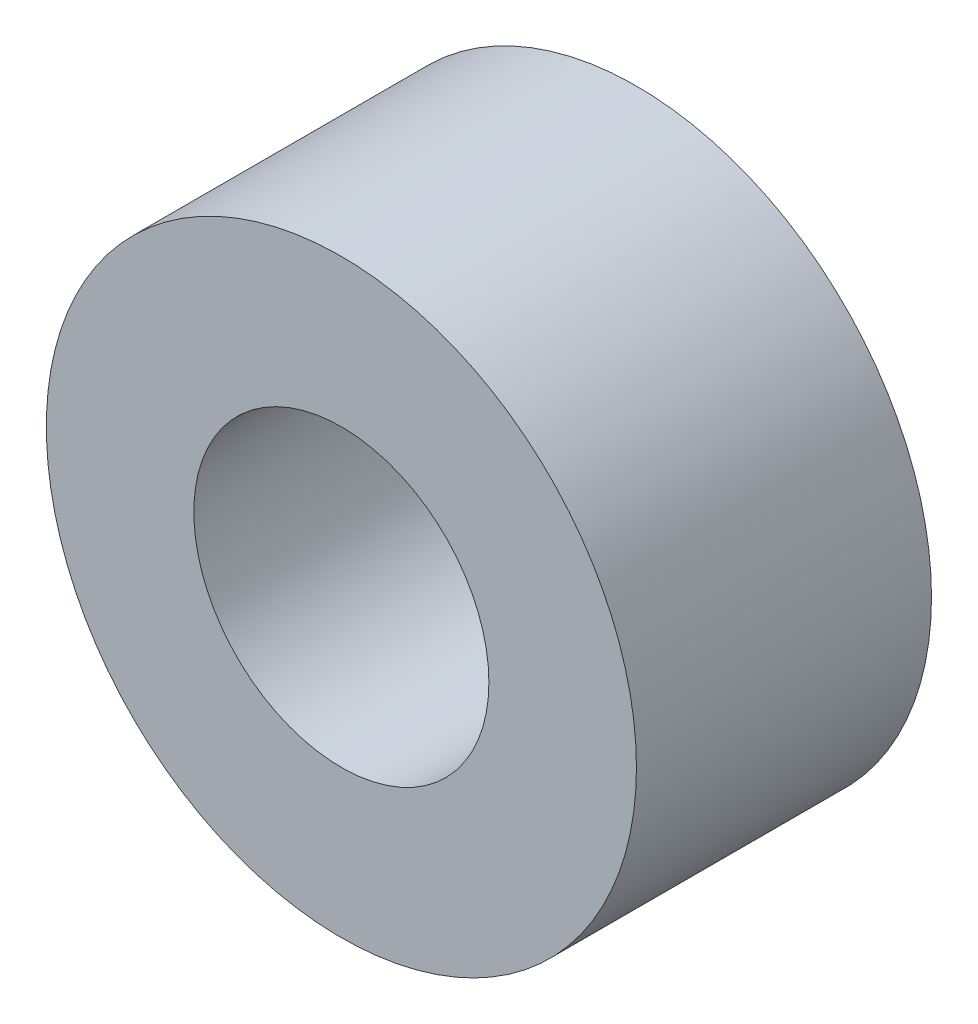
ISO-10303-21;
HEADER;
FILE_DESCRIPTION(('STEP AP214'),'2;1');
FILE_NAME('part.step','',(''),(''),'','','');
FILE_SCHEMA(('AUTOMOTIVE_DESIGN { 1 0 10303 214 1 1 1 1 }'));
ENDSEC;
DATA;
#1=APPLICATION_CONTEXT('core data for automotive mechanical design processes');
#2=APPLICATION_PROTOCOL_DEFINITION('international standard','automotive_design',2000,#1);
#3=PRODUCT_CONTEXT('',#1,'mechanical');
#4=PRODUCT('Part','Part','',(#3));
#5=PRODUCT_RELATED_PRODUCT_CATEGORY('part','',(#4));
#6=PRODUCT_DEFINITION_FORMATION('','',#4);
#7=PRODUCT_DEFINITION_CONTEXT('part definition',#1,'design');
#8=PRODUCT_DEFINITION('design','',#6,#7);
#9=PRODUCT_DEFINITION_SHAPE('','',#8);
#10=(LENGTH_UNIT() NAMED_UNIT(*) SI_UNIT(.MILLI.,.METRE.));
#11=(NAMED_UNIT(*) PLANE_ANGLE_UNIT() SI_UNIT($,.RADIAN.));
#12=(NAMED_UNIT(*) SI_UNIT($,.STERADIAN.) SOLID_ANGLE_UNIT());
#13=UNCERTAINTY_MEASURE_WITH_UNIT(LENGTH_MEASURE(1.E-05),#10,'distance_accuracy_value','');
#14=(GEOMETRIC_REPRESENTATION_CONTEXT(3) GLOBAL_UNCERTAINTY_ASSIGNED_CONTEXT((#13)) GLOBAL_UNIT_ASSIGNED_CONTEXT((#10,
#11,#12)) REPRESENTATION_CONTEXT('',''));
#15=CARTESIAN_POINT('',(0.,0.,0.));
#16=DIRECTION('',(0.,0.,1.));
#17=DIRECTION('',(1.,0.,0.));
#18=AXIS2_PLACEMENT_3D('',#15,#16,#17);
#19=CARTESIAN_POINT('',(0.,0.,3.175));
#20=DIRECTION('',(0.,0.,1.));
#21=DIRECTION('',(1.,0.,0.));
#22=AXIS2_PLACEMENT_3D('',#19,#20,#21);
#23=PLANE('',#22);
#24=CARTESIAN_POINT('',(0.,0.,3.175));
#25=DIRECTION('',(0.,0.,1.));
#26=DIRECTION('',(1.,0.,0.));
#27=AXIS2_PLACEMENT_3D('',#24,#25,#26);
#28=CIRCLE('',#27,3.175);
#29=CARTESIAN_POINT('',(3.175,0.,3.175));
#30=VERTEX_POINT('',#29);
#31=EDGE_CURVE('E10',#30,#30,#28,.T.);
#32=ORIENTED_EDGE('',*,*,#31,.T.);
#33=EDGE_LOOP('',(#32));
#34=FACE_BOUND('',#33,.T.);
#35=CARTESIAN_POINT('',(0.,0.,3.175));
#36=DIRECTION('',(0.,0.,1.));
#37=DIRECTION('',(1.,0.,0.));
#38=AXIS2_PLACEMENT_3D('',#35,#36,#37);
#39=CIRCLE('',#38,1.5875);
#40=CARTESIAN_POINT('',(1.5875,0.,3.175));
#41=VERTEX_POINT('',#40);
#42=EDGE_CURVE('E53',#41,#41,#39,.T.);
#43=ORIENTED_EDGE('',*,*,#42,.F.);
#44=EDGE_LOOP('',(#43));
#45=FACE_BOUND('',#44,.T.);
#46=ADVANCED_FACE('F40',(#34,#45),#23,.T.);
#47=CARTESIAN_POINT('',(0.,0.,0.));
#48=DIRECTION('',(0.,0.,1.));
#49=DIRECTION('',(1.,0.,0.));
#50=AXIS2_PLACEMENT_3D('',#47,#48,#49);
#51=PLANE('',#50);
#52=CARTESIAN_POINT('',(0.,0.,0.));
#53=DIRECTION('',(0.,0.,1.));
#54=DIRECTION('',(1.,0.,0.));
#55=AXIS2_PLACEMENT_3D('',#52,#53,#54);
#56=CIRCLE('',#55,3.175);
#57=CARTESIAN_POINT('',(3.175,0.,0.));
#58=VERTEX_POINT('',#57);
#59=EDGE_CURVE('E44',#58,#58,#56,.T.);
#60=ORIENTED_EDGE('',*,*,#59,.F.);
#61=EDGE_LOOP('',(#60));
#62=FACE_BOUND('',#61,.T.);
#63=CARTESIAN_POINT('',(0.,0.,0.));
#64=DIRECTION('',(0.,0.,1.));
#65=DIRECTION('',(1.,0.,0.));
#66=AXIS2_PLACEMENT_3D('',#63,#64,#65);
#67=CIRCLE('',#66,1.5875);
#68=CARTESIAN_POINT('',(1.5875,0.,0.));
#69=VERTEX_POINT('',#68);
#70=EDGE_CURVE('E55',#69,#69,#67,.T.);
#71=ORIENTED_EDGE('',*,*,#70,.T.);
#72=EDGE_LOOP('',(#71));
#73=FACE_BOUND('',#72,.T.);
#74=ADVANCED_FACE('F67',(#62,#73),#51,.F.);
#75=CARTESIAN_POINT('',(0.,0.,3.175));
#76=DIRECTION('',(0.,0.,-1.));
#77=DIRECTION('',(-1.,0.,0.));
#78=AXIS2_PLACEMENT_3D('',#75,#76,#77);
#79=CYLINDRICAL_SURFACE('',#78,3.175);
#80=ORIENTED_EDGE('',*,*,#31,.F.);
#81=EDGE_LOOP('',(#80));
#82=FACE_BOUND('',#81,.T.);
#83=ORIENTED_EDGE('',*,*,#59,.T.);
#84=EDGE_LOOP('',(#83));
#85=FACE_BOUND('',#84,.T.);
#86=ADVANCED_FACE('F42',(#82,#85),#79,.T.);
#87=CARTESIAN_POINT('',(0.,0.,3.175));
#88=DIRECTION('',(0.,0.,-1.));
#89=DIRECTION('',(-1.,0.,0.));
#90=AXIS2_PLACEMENT_3D('',#87,#88,#89);
#91=CYLINDRICAL_SURFACE('',#90,1.5875);
#92=ORIENTED_EDGE('',*,*,#42,.T.);
#93=EDGE_LOOP('',(#92));
#94=FACE_BOUND('',#93,.T.);
#95=ORIENTED_EDGE('',*,*,#70,.F.);
#96=EDGE_LOOP('',(#95));
#97=FACE_BOUND('',#96,.T.);
#98=ADVANCED_FACE('F63',(#94,#97),#91,.F.);
#99=CLOSED_SHELL('',(#46,#74,#86,#98));
#100=MANIFOLD_SOLID_BREP('B2',#99);
#101=ADVANCED_BREP_SHAPE_REPRESENTATION('',(#18,#100),#14);
#102=SHAPE_DEFINITION_REPRESENTATION(#9,#101);
ENDSEC;
END-ISO-10303-21;
